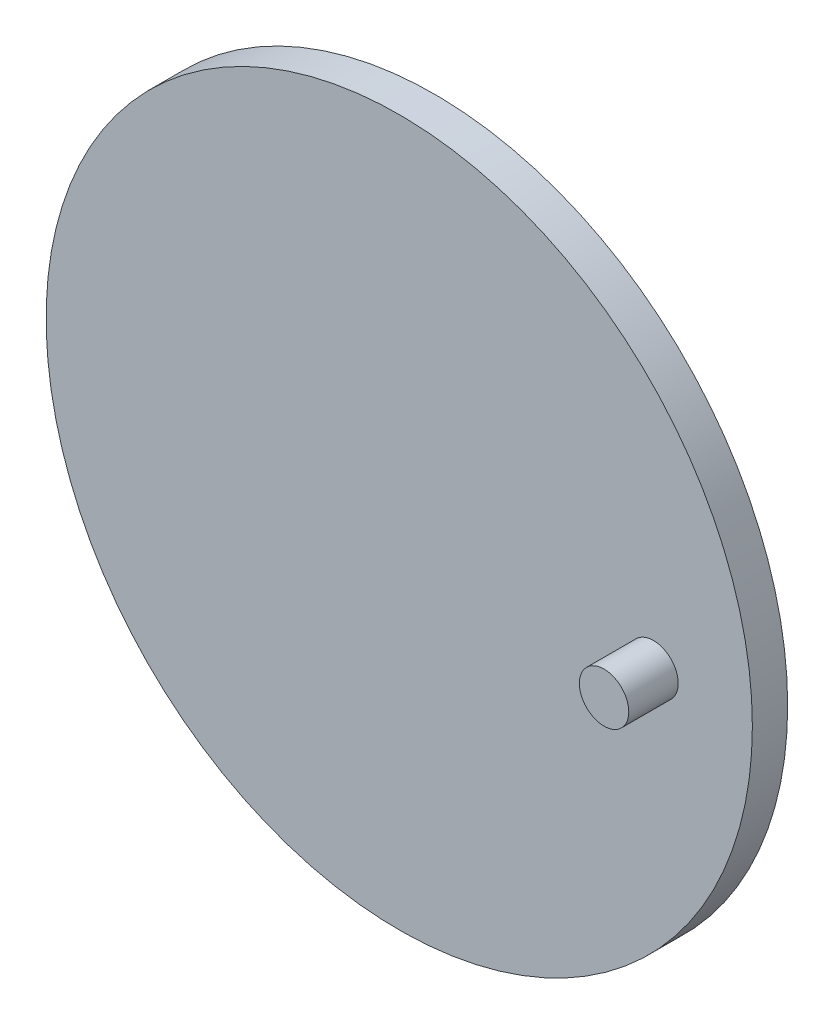
ISO-10303-21;
HEADER;
FILE_DESCRIPTION(('STEP AP214'),'2;1');
FILE_NAME('part.step','',(''),(''),'','','');
FILE_SCHEMA(('AUTOMOTIVE_DESIGN { 1 0 10303 214 1 1 1 1 }'));
ENDSEC;
DATA;
#1=APPLICATION_CONTEXT('core data for automotive mechanical design processes');
#2=APPLICATION_PROTOCOL_DEFINITION('international standard','automotive_design',2000,#1);
#3=PRODUCT_CONTEXT('',#1,'mechanical');
#4=PRODUCT('Part','Part','',(#3));
#5=PRODUCT_RELATED_PRODUCT_CATEGORY('part','',(#4));
#6=PRODUCT_DEFINITION_FORMATION('','',#4);
#7=PRODUCT_DEFINITION_CONTEXT('part definition',#1,'design');
#8=PRODUCT_DEFINITION('design','',#6,#7);
#9=PRODUCT_DEFINITION_SHAPE('','',#8);
#10=(LENGTH_UNIT() NAMED_UNIT(*) SI_UNIT(.MILLI.,.METRE.));
#11=(NAMED_UNIT(*) PLANE_ANGLE_UNIT() SI_UNIT($,.RADIAN.));
#12=(NAMED_UNIT(*) SI_UNIT($,.STERADIAN.) SOLID_ANGLE_UNIT());
#13=UNCERTAINTY_MEASURE_WITH_UNIT(LENGTH_MEASURE(1.E-05),#10,'distance_accuracy_value','');
#14=(GEOMETRIC_REPRESENTATION_CONTEXT(3) GLOBAL_UNCERTAINTY_ASSIGNED_CONTEXT((#13)) GLOBAL_UNIT_ASSIGNED_CONTEXT((#10,
#11,#12)) REPRESENTATION_CONTEXT('',''));
#15=CARTESIAN_POINT('',(0.,0.,0.));
#16=DIRECTION('',(0.,0.,1.));
#17=DIRECTION('',(1.,0.,0.));
#18=AXIS2_PLACEMENT_3D('',#15,#16,#17);
#19=CARTESIAN_POINT('',(0.,0.,6.35));
#20=DIRECTION('',(0.,0.,1.));
#21=DIRECTION('',(1.,0.,0.));
#22=AXIS2_PLACEMENT_3D('',#19,#20,#21);
#23=PLANE('',#22);
#24=CARTESIAN_POINT('',(0.,0.,6.35));
#25=DIRECTION('',(0.,0.,1.));
#26=DIRECTION('',(1.,0.,0.));
#27=AXIS2_PLACEMENT_3D('',#24,#25,#26);
#28=CIRCLE('',#27,63.5);
#29=CARTESIAN_POINT('',(63.5,0.,6.35));
#30=VERTEX_POINT('',#29);
#31=EDGE_CURVE('E11',#30,#30,#28,.T.);
#32=ORIENTED_EDGE('',*,*,#31,.T.);
#33=EDGE_LOOP('',(#32));
#34=FACE_BOUND('',#33,.T.);
#35=CARTESIAN_POINT('',(45.72,0.,6.35));
#36=DIRECTION('',(0.,0.,1.));
#37=DIRECTION('',(1.,0.,0.));
#38=AXIS2_PLACEMENT_3D('',#35,#36,#37);
#39=CIRCLE('',#38,4.445);
#40=CARTESIAN_POINT('',(50.165,0.,6.35));
#41=VERTEX_POINT('',#40);
#42=EDGE_CURVE('E55',#41,#41,#39,.T.);
#43=ORIENTED_EDGE('',*,*,#42,.F.);
#44=EDGE_LOOP('',(#43));
#45=FACE_BOUND('',#44,.T.);
#46=ADVANCED_FACE('F42',(#34,#45),#23,.T.);
#47=CARTESIAN_POINT('',(0.,0.,6.35));
#48=DIRECTION('',(0.,0.,-1.));
#49=DIRECTION('',(-1.,0.,0.));
#50=AXIS2_PLACEMENT_3D('',#47,#48,#49);
#51=CYLINDRICAL_SURFACE('',#50,63.5);
#52=ORIENTED_EDGE('',*,*,#31,.F.);
#53=EDGE_LOOP('',(#52));
#54=FACE_BOUND('',#53,.T.);
#55=CARTESIAN_POINT('',(0.,0.,0.));
#56=DIRECTION('',(0.,0.,1.));
#57=DIRECTION('',(1.,0.,0.));
#58=AXIS2_PLACEMENT_3D('',#55,#56,#57);
#59=CIRCLE('',#58,63.5);
#60=CARTESIAN_POINT('',(63.5,0.,0.));
#61=VERTEX_POINT('',#60);
#62=EDGE_CURVE('E46',#61,#61,#59,.T.);
#63=ORIENTED_EDGE('',*,*,#62,.T.);
#64=EDGE_LOOP('',(#63));
#65=FACE_BOUND('',#64,.T.);
#66=ADVANCED_FACE('F44',(#54,#65),#51,.T.);
#67=CARTESIAN_POINT('',(0.,0.,0.));
#68=DIRECTION('',(0.,0.,1.));
#69=DIRECTION('',(1.,0.,0.));
#70=AXIS2_PLACEMENT_3D('',#67,#68,#69);
#71=PLANE('',#70);
#72=CARTESIAN_POINT('',(0.,0.,0.));
#73=DIRECTION('',(0.,0.,1.));
#74=DIRECTION('',(1.,0.,0.));
#75=AXIS2_PLACEMENT_3D('',#72,#73,#74);
#76=CIRCLE('',#75,4.445);
#77=CARTESIAN_POINT('',(4.445,0.,0.));
#78=VERTEX_POINT('',#77);
#79=EDGE_CURVE('E58',#78,#78,#76,.T.);
#80=ORIENTED_EDGE('',*,*,#79,.T.);
#81=EDGE_LOOP('',(#80));
#82=FACE_BOUND('',#81,.T.);
#83=ORIENTED_EDGE('',*,*,#62,.F.);
#84=EDGE_LOOP('',(#83));
#85=FACE_BOUND('',#84,.T.);
#86=ADVANCED_FACE('F96',(#82,#85),#71,.F.);
#87=CARTESIAN_POINT('',(45.72,0.,15.24));
#88=DIRECTION('',(0.,0.,-1.));
#89=DIRECTION('',(-1.,0.,0.));
#90=AXIS2_PLACEMENT_3D('',#87,#88,#89);
#91=CYLINDRICAL_SURFACE('',#90,4.445);
#92=CARTESIAN_POINT('',(45.72,0.,15.24));
#93=DIRECTION('',(0.,0.,1.));
#94=DIRECTION('',(1.,0.,0.));
#95=AXIS2_PLACEMENT_3D('',#92,#93,#94);
#96=CIRCLE('',#95,4.445);
#97=CARTESIAN_POINT('',(50.165,0.,15.24));
#98=VERTEX_POINT('',#97);
#99=EDGE_CURVE('E53',#98,#98,#96,.T.);
#100=ORIENTED_EDGE('',*,*,#99,.F.);
#101=EDGE_LOOP('',(#100));
#102=FACE_BOUND('',#101,.T.);
#103=ORIENTED_EDGE('',*,*,#42,.T.);
#104=EDGE_LOOP('',(#103));
#105=FACE_BOUND('',#104,.T.);
#106=ADVANCED_FACE('F100',(#102,#105),#91,.T.);
#107=CARTESIAN_POINT('',(45.72,0.,15.24));
#108=DIRECTION('',(0.,0.,1.));
#109=DIRECTION('',(1.,0.,0.));
#110=AXIS2_PLACEMENT_3D('',#107,#108,#109);
#111=PLANE('',#110);
#112=ORIENTED_EDGE('',*,*,#99,.T.);
#113=EDGE_LOOP('',(#112));
#114=FACE_BOUND('',#113,.T.);
#115=ADVANCED_FACE('F107',(#114),#111,.T.);
#116=CARTESIAN_POINT('',(0.,0.,-6.35));
#117=DIRECTION('',(0.,0.,1.));
#118=DIRECTION('',(1.,0.,0.));
#119=AXIS2_PLACEMENT_3D('',#116,#117,#118);
#120=CYLINDRICAL_SURFACE('',#119,4.445);
#121=CARTESIAN_POINT('',(0.,0.,-6.35));
#122=DIRECTION('',(0.,0.,-1.));
#123=DIRECTION('',(-1.,0.,0.));
#124=AXIS2_PLACEMENT_3D('',#121,#122,#123);
#125=CIRCLE('',#124,4.445);
#126=CARTESIAN_POINT('',(-4.445,0.,-6.35));
#127=VERTEX_POINT('',#126);
#128=EDGE_CURVE('E63',#127,#127,#125,.F.);
#129=ORIENTED_EDGE('',*,*,#128,.T.);
#130=EDGE_LOOP('',(#129));
#131=FACE_BOUND('',#130,.T.);
#132=ORIENTED_EDGE('',*,*,#79,.F.);
#133=EDGE_LOOP('',(#132));
#134=FACE_BOUND('',#133,.T.);
#135=ADVANCED_FACE('F78',(#131,#134),#120,.T.);
#136=CARTESIAN_POINT('',(0.,0.,-8.89));
#137=DIRECTION('',(0.,0.,1.));
#138=DIRECTION('',(1.,0.,0.));
#139=AXIS2_PLACEMENT_3D('',#136,#137,#138);
#140=CYLINDRICAL_SURFACE('',#139,7.66524607373307);
#141=CARTESIAN_POINT('',(0.,0.,-8.89));
#142=DIRECTION('',(0.,0.,-1.));
#143=DIRECTION('',(-1.,0.,0.));
#144=AXIS2_PLACEMENT_3D('',#141,#142,#143);
#145=CIRCLE('',#144,7.66524607373307);
#146=CARTESIAN_POINT('',(-7.66524607373307,0.,-8.89));
#147=VERTEX_POINT('',#146);
#148=EDGE_CURVE('E66',#147,#147,#145,.T.);
#149=ORIENTED_EDGE('',*,*,#148,.F.);
#150=EDGE_LOOP('',(#149));
#151=FACE_BOUND('',#150,.T.);
#152=CARTESIAN_POINT('',(0.,0.,-6.35));
#153=DIRECTION('',(0.,0.,-1.));
#154=DIRECTION('',(-1.,0.,0.));
#155=AXIS2_PLACEMENT_3D('',#152,#153,#154);
#156=CIRCLE('',#155,7.66524607373307);
#157=CARTESIAN_POINT('',(-7.66524607373307,0.,-6.35));
#158=VERTEX_POINT('',#157);
#159=EDGE_CURVE('E67',#158,#158,#156,.T.);
#160=ORIENTED_EDGE('',*,*,#159,.T.);
#161=EDGE_LOOP('',(#160));
#162=FACE_BOUND('',#161,.T.);
#163=ADVANCED_FACE('F75',(#151,#162),#140,.T.);
#164=CARTESIAN_POINT('',(0.,0.,-8.89));
#165=DIRECTION('',(0.,0.,-1.));
#166=DIRECTION('',(-1.,0.,0.));
#167=AXIS2_PLACEMENT_3D('',#164,#165,#166);
#168=PLANE('',#167);
#169=ORIENTED_EDGE('',*,*,#148,.T.);
#170=EDGE_LOOP('',(#169));
#171=FACE_BOUND('',#170,.T.);
#172=ADVANCED_FACE('F73',(#171),#168,.T.);
#173=CARTESIAN_POINT('',(0.,0.,-6.35));
#174=DIRECTION('',(0.,0.,-1.));
#175=DIRECTION('',(-1.,0.,0.));
#176=AXIS2_PLACEMENT_3D('',#173,#174,#175);
#177=PLANE('',#176);
#178=ORIENTED_EDGE('',*,*,#128,.F.);
#179=EDGE_LOOP('',(#178));
#180=FACE_BOUND('',#179,.T.);
#181=ORIENTED_EDGE('',*,*,#159,.F.);
#182=EDGE_LOOP('',(#181));
#183=FACE_BOUND('',#182,.T.);
#184=ADVANCED_FACE('F82',(#180,#183),#177,.F.);
#185=CLOSED_SHELL('',(#46,#66,#86,#106,#115,#135,#163,#172,#184));
#186=MANIFOLD_SOLID_BREP('B2',#185);
#187=ADVANCED_BREP_SHAPE_REPRESENTATION('',(#18,#186),#14);
#188=SHAPE_DEFINITION_REPRESENTATION(#9,#187);
ENDSEC;
END-ISO-10303-21;
